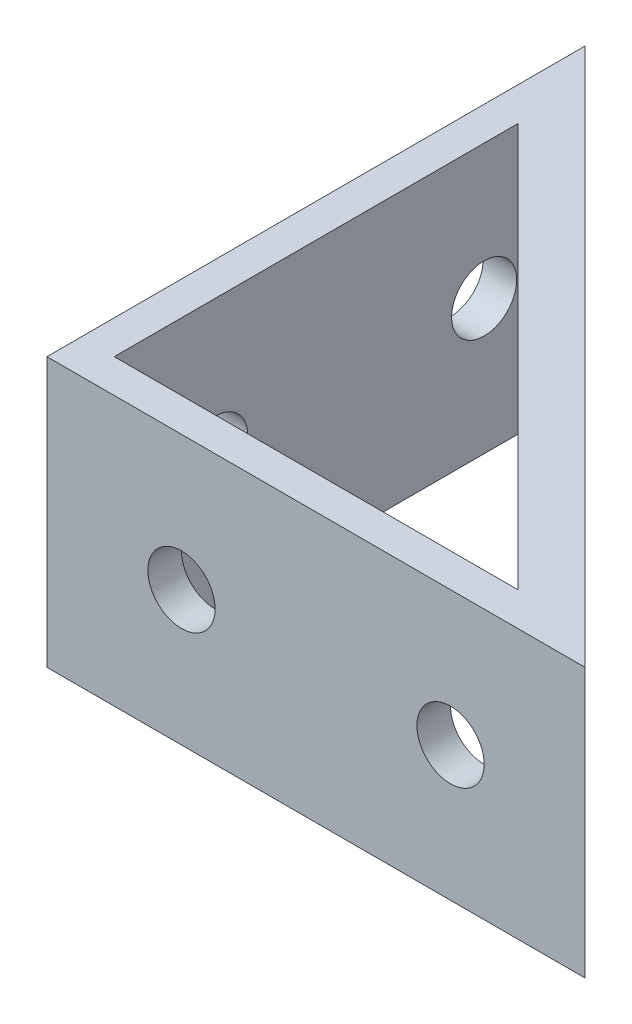
ISO-10303-21;
HEADER;
FILE_DESCRIPTION(('STEP AP214'),'2;1');
FILE_NAME('part.step','',(''),(''),'','','');
FILE_SCHEMA(('AUTOMOTIVE_DESIGN { 1 0 10303 214 1 1 1 1 }'));
ENDSEC;
DATA;
#1=APPLICATION_CONTEXT('core data for automotive mechanical design processes');
#2=APPLICATION_PROTOCOL_DEFINITION('international standard','automotive_design',2000,#1);
#3=PRODUCT_CONTEXT('',#1,'mechanical');
#4=PRODUCT('Part','Part','',(#3));
#5=PRODUCT_RELATED_PRODUCT_CATEGORY('part','',(#4));
#6=PRODUCT_DEFINITION_FORMATION('','',#4);
#7=PRODUCT_DEFINITION_CONTEXT('part definition',#1,'design');
#8=PRODUCT_DEFINITION('design','',#6,#7);
#9=PRODUCT_DEFINITION_SHAPE('','',#8);
#10=(LENGTH_UNIT() NAMED_UNIT(*) SI_UNIT(.MILLI.,.METRE.));
#11=(NAMED_UNIT(*) PLANE_ANGLE_UNIT() SI_UNIT($,.RADIAN.));
#12=(NAMED_UNIT(*) SI_UNIT($,.STERADIAN.) SOLID_ANGLE_UNIT());
#13=UNCERTAINTY_MEASURE_WITH_UNIT(LENGTH_MEASURE(1.E-05),#10,'distance_accuracy_value','');
#14=(GEOMETRIC_REPRESENTATION_CONTEXT(3) GLOBAL_UNCERTAINTY_ASSIGNED_CONTEXT((#13)) GLOBAL_UNIT_ASSIGNED_CONTEXT((#10,
#11,#12)) REPRESENTATION_CONTEXT('',''));
#15=CARTESIAN_POINT('',(0.,0.,0.));
#16=DIRECTION('',(0.,0.,1.));
#17=DIRECTION('',(1.,0.,0.));
#18=AXIS2_PLACEMENT_3D('',#15,#16,#17);
#19=CARTESIAN_POINT('',(0.,25.4,0.));
#20=DIRECTION('',(0.,-1.,0.));
#21=DIRECTION('',(0.,0.,-1.));
#22=AXIS2_PLACEMENT_3D('',#19,#20,#21);
#23=PLANE('',#22);
#24=DIRECTION('',(1.,0.,0.));
#25=VECTOR('',#24,1.);
#26=CARTESIAN_POINT('',(50.8,25.4,0.));
#27=LINE('',#26,#25);
#28=CARTESIAN_POINT('',(0.,25.4,0.));
#29=VERTEX_POINT('',#28);
#30=CARTESIAN_POINT('',(50.8,25.4,0.));
#31=VERTEX_POINT('',#30);
#32=EDGE_CURVE('E136',#29,#31,#27,.T.);
#33=ORIENTED_EDGE('',*,*,#32,.T.);
#34=DIRECTION('',(-0.707106781186547,0.,-0.707106781186547));
#35=VECTOR('',#34,1.);
#36=CARTESIAN_POINT('',(0.,25.4,-50.8));
#37=LINE('',#36,#35);
#38=CARTESIAN_POINT('',(0.,25.4,-50.8));
#39=VERTEX_POINT('',#38);
#40=EDGE_CURVE('E139',#31,#39,#37,.T.);
#41=ORIENTED_EDGE('',*,*,#40,.T.);
#42=DIRECTION('',(0.,0.,1.));
#43=VECTOR('',#42,1.);
#44=CARTESIAN_POINT('',(0.,25.4,0.));
#45=LINE('',#44,#43);
#46=EDGE_CURVE('E142',#39,#29,#45,.T.);
#47=ORIENTED_EDGE('',*,*,#46,.T.);
#48=EDGE_LOOP('',(#33,#41,#47));
#49=FACE_BOUND('',#48,.T.);
#50=DIRECTION('',(1.,0.,0.));
#51=VECTOR('',#50,1.);
#52=CARTESIAN_POINT('',(41.275,25.4,-3.175));
#53=LINE('',#52,#51);
#54=CARTESIAN_POINT('',(3.175,25.4,-3.17499999999999));
#55=VERTEX_POINT('',#54);
#56=CARTESIAN_POINT('',(41.275,25.4,-3.175));
#57=VERTEX_POINT('',#56);
#58=EDGE_CURVE('E100',#55,#57,#53,.T.);
#59=ORIENTED_EDGE('',*,*,#58,.F.);
#60=DIRECTION('',(0.,0.,1.));
#61=VECTOR('',#60,1.);
#62=CARTESIAN_POINT('',(3.175,25.4,-3.17499999999999));
#63=LINE('',#62,#61);
#64=CARTESIAN_POINT('',(3.175,25.4,-41.275));
#65=VERTEX_POINT('',#64);
#66=EDGE_CURVE('E120',#65,#55,#63,.T.);
#67=ORIENTED_EDGE('',*,*,#66,.F.);
#68=DIRECTION('',(-0.707106781186547,0.,-0.707106781186547));
#69=VECTOR('',#68,1.);
#70=CARTESIAN_POINT('',(3.175,25.4,-41.275));
#71=LINE('',#70,#69);
#72=EDGE_CURVE('E110',#57,#65,#71,.T.);
#73=ORIENTED_EDGE('',*,*,#72,.F.);
#74=EDGE_LOOP('',(#59,#67,#73));
#75=FACE_BOUND('',#74,.T.);
#76=ADVANCED_FACE('F36',(#49,#75),#23,.F.);
#77=CARTESIAN_POINT('',(0.,0.,0.));
#78=DIRECTION('',(0.,-1.,0.));
#79=DIRECTION('',(0.,0.,-1.));
#80=AXIS2_PLACEMENT_3D('',#77,#78,#79);
#81=PLANE('',#80);
#82=DIRECTION('',(1.,0.,0.));
#83=VECTOR('',#82,1.);
#84=CARTESIAN_POINT('',(50.8,0.,0.));
#85=LINE('',#84,#83);
#86=CARTESIAN_POINT('',(0.,0.,0.));
#87=VERTEX_POINT('',#86);
#88=CARTESIAN_POINT('',(50.8,0.,0.));
#89=VERTEX_POINT('',#88);
#90=EDGE_CURVE('E117',#87,#89,#85,.T.);
#91=ORIENTED_EDGE('',*,*,#90,.F.);
#92=DIRECTION('',(0.,0.,1.));
#93=VECTOR('',#92,1.);
#94=CARTESIAN_POINT('',(0.,0.,0.));
#95=LINE('',#94,#93);
#96=CARTESIAN_POINT('',(0.,0.,-50.8));
#97=VERTEX_POINT('',#96);
#98=EDGE_CURVE('E140',#97,#87,#95,.T.);
#99=ORIENTED_EDGE('',*,*,#98,.F.);
#100=DIRECTION('',(-0.707106781186547,0.,-0.707106781186547));
#101=VECTOR('',#100,1.);
#102=CARTESIAN_POINT('',(0.,0.,-50.8));
#103=LINE('',#102,#101);
#104=EDGE_CURVE('E147',#89,#97,#103,.T.);
#105=ORIENTED_EDGE('',*,*,#104,.F.);
#106=EDGE_LOOP('',(#91,#99,#105));
#107=FACE_BOUND('',#106,.T.);
#108=DIRECTION('',(0.,0.,1.));
#109=VECTOR('',#108,1.);
#110=CARTESIAN_POINT('',(3.175,0.,-3.17499999999999));
#111=LINE('',#110,#109);
#112=CARTESIAN_POINT('',(3.175,0.,-41.275));
#113=VERTEX_POINT('',#112);
#114=CARTESIAN_POINT('',(3.175,0.,-3.17499999999999));
#115=VERTEX_POINT('',#114);
#116=EDGE_CURVE('E111',#113,#115,#111,.T.);
#117=ORIENTED_EDGE('',*,*,#116,.T.);
#118=DIRECTION('',(1.,0.,0.));
#119=VECTOR('',#118,1.);
#120=CARTESIAN_POINT('',(41.275,0.,-3.175));
#121=LINE('',#120,#119);
#122=CARTESIAN_POINT('',(41.275,0.,-3.175));
#123=VERTEX_POINT('',#122);
#124=EDGE_CURVE('E125',#115,#123,#121,.T.);
#125=ORIENTED_EDGE('',*,*,#124,.T.);
#126=DIRECTION('',(-0.707106781186547,0.,-0.707106781186547));
#127=VECTOR('',#126,1.);
#128=CARTESIAN_POINT('',(3.175,0.,-41.275));
#129=LINE('',#128,#127);
#130=EDGE_CURVE('E128',#123,#113,#129,.T.);
#131=ORIENTED_EDGE('',*,*,#130,.T.);
#132=EDGE_LOOP('',(#117,#125,#131));
#133=FACE_BOUND('',#132,.T.);
#134=ADVANCED_FACE('F195',(#107,#133),#81,.T.);
#135=CARTESIAN_POINT('',(50.8,25.4,0.));
#136=DIRECTION('',(0.,0.,-1.));
#137=DIRECTION('',(-1.,0.,0.));
#138=AXIS2_PLACEMENT_3D('',#135,#136,#137);
#139=PLANE('',#138);
#140=CARTESIAN_POINT('',(38.1,12.7,0.));
#141=DIRECTION('',(0.,0.,1.));
#142=DIRECTION('',(1.,0.,0.));
#143=AXIS2_PLACEMENT_3D('',#140,#141,#142);
#144=CIRCLE('',#143,3.175);
#145=CARTESIAN_POINT('',(41.275,12.7,0.));
#146=VERTEX_POINT('',#145);
#147=EDGE_CURVE('E272',#146,#146,#144,.T.);
#148=ORIENTED_EDGE('',*,*,#147,.F.);
#149=EDGE_LOOP('',(#148));
#150=FACE_BOUND('',#149,.T.);
#151=CARTESIAN_POINT('',(12.7,12.7,0.));
#152=DIRECTION('',(0.,0.,1.));
#153=DIRECTION('',(1.,0.,0.));
#154=AXIS2_PLACEMENT_3D('',#151,#152,#153);
#155=CIRCLE('',#154,3.17499999999999);
#156=CARTESIAN_POINT('',(15.875,12.7,0.));
#157=VERTEX_POINT('',#156);
#158=EDGE_CURVE('E170',#157,#157,#155,.T.);
#159=ORIENTED_EDGE('',*,*,#158,.F.);
#160=EDGE_LOOP('',(#159));
#161=FACE_BOUND('',#160,.T.);
#162=ORIENTED_EDGE('',*,*,#90,.T.);
#163=DIRECTION('',(0.,-1.,0.));
#164=VECTOR('',#163,1.);
#165=CARTESIAN_POINT('',(50.8,25.4,0.));
#166=LINE('',#165,#164);
#167=EDGE_CURVE('E11',#31,#89,#166,.T.);
#168=ORIENTED_EDGE('',*,*,#167,.F.);
#169=ORIENTED_EDGE('',*,*,#32,.F.);
#170=DIRECTION('',(0.,-1.,0.));
#171=VECTOR('',#170,1.);
#172=CARTESIAN_POINT('',(0.,25.4,0.));
#173=LINE('',#172,#171);
#174=EDGE_CURVE('E144',#29,#87,#173,.T.);
#175=ORIENTED_EDGE('',*,*,#174,.T.);
#176=EDGE_LOOP('',(#162,#168,#169,#175));
#177=FACE_BOUND('',#176,.T.);
#178=ADVANCED_FACE('F38',(#150,#161,#177),#139,.F.);
#179=CARTESIAN_POINT('',(0.,25.4,-50.8));
#180=DIRECTION('',(-0.707106781186548,0.,0.707106781186548));
#181=DIRECTION('',(0.707106781186548,0.,0.707106781186548));
#182=AXIS2_PLACEMENT_3D('',#179,#180,#181);
#183=PLANE('',#182);
#184=CARTESIAN_POINT('',(38.1,12.7,-12.7));
#185=DIRECTION('',(-0.707106781186548,0.,0.707106781186548));
#186=DIRECTION('',(0.707106781186548,0.,0.707106781186548));
#187=AXIS2_PLACEMENT_3D('',#184,#185,#186);
#188=ELLIPSE('',#187,4.49012806053457,3.17499999999999);
#189=CARTESIAN_POINT('',(41.275,12.7,-9.52500000000001));
#190=VERTEX_POINT('',#189);
#191=EDGE_CURVE('E219',#190,#190,#188,.T.);
#192=ORIENTED_EDGE('',*,*,#191,.T.);
#193=EDGE_LOOP('',(#192));
#194=FACE_BOUND('',#193,.T.);
#195=CARTESIAN_POINT('',(12.7,12.7,-38.1));
#196=DIRECTION('',(-0.707106781186548,0.,0.707106781186548));
#197=DIRECTION('',(0.707106781186548,0.,0.707106781186548));
#198=AXIS2_PLACEMENT_3D('',#195,#196,#197);
#199=ELLIPSE('',#198,4.49012806053456,3.17499999999999);
#200=CARTESIAN_POINT('',(15.875,12.7,-34.925));
#201=VERTEX_POINT('',#200);
#202=EDGE_CURVE('E169',#201,#201,#199,.T.);
#203=ORIENTED_EDGE('',*,*,#202,.T.);
#204=EDGE_LOOP('',(#203));
#205=FACE_BOUND('',#204,.T.);
#206=ORIENTED_EDGE('',*,*,#104,.T.);
#207=DIRECTION('',(0.,-1.,0.));
#208=VECTOR('',#207,1.);
#209=CARTESIAN_POINT('',(0.,25.4,-50.8));
#210=LINE('',#209,#208);
#211=EDGE_CURVE('E50',#39,#97,#210,.T.);
#212=ORIENTED_EDGE('',*,*,#211,.F.);
#213=ORIENTED_EDGE('',*,*,#40,.F.);
#214=ORIENTED_EDGE('',*,*,#167,.T.);
#215=EDGE_LOOP('',(#206,#212,#213,#214));
#216=FACE_BOUND('',#215,.T.);
#217=ADVANCED_FACE('F208',(#194,#205,#216),#183,.F.);
#218=CARTESIAN_POINT('',(0.,25.4,0.));
#219=DIRECTION('',(1.,0.,0.));
#220=DIRECTION('',(0.,0.,-1.));
#221=AXIS2_PLACEMENT_3D('',#218,#219,#220);
#222=PLANE('',#221);
#223=CARTESIAN_POINT('',(0.,12.7,-12.7));
#224=DIRECTION('',(-1.,0.,0.));
#225=DIRECTION('',(0.,0.,1.));
#226=AXIS2_PLACEMENT_3D('',#223,#224,#225);
#227=CIRCLE('',#226,3.0734);
#228=CARTESIAN_POINT('',(0.,12.7,-9.6266));
#229=VERTEX_POINT('',#228);
#230=EDGE_CURVE('E161',#229,#229,#227,.T.);
#231=ORIENTED_EDGE('',*,*,#230,.F.);
#232=EDGE_LOOP('',(#231));
#233=FACE_BOUND('',#232,.T.);
#234=CARTESIAN_POINT('',(0.,12.7,-38.1));
#235=DIRECTION('',(-1.,0.,0.));
#236=DIRECTION('',(0.,0.,1.));
#237=AXIS2_PLACEMENT_3D('',#234,#235,#236);
#238=CIRCLE('',#237,3.0734);
#239=CARTESIAN_POINT('',(0.,12.7,-35.0266));
#240=VERTEX_POINT('',#239);
#241=EDGE_CURVE('E157',#240,#240,#238,.T.);
#242=ORIENTED_EDGE('',*,*,#241,.F.);
#243=EDGE_LOOP('',(#242));
#244=FACE_BOUND('',#243,.T.);
#245=ORIENTED_EDGE('',*,*,#98,.T.);
#246=ORIENTED_EDGE('',*,*,#174,.F.);
#247=ORIENTED_EDGE('',*,*,#46,.F.);
#248=ORIENTED_EDGE('',*,*,#211,.T.);
#249=EDGE_LOOP('',(#245,#246,#247,#248));
#250=FACE_BOUND('',#249,.T.);
#251=ADVANCED_FACE('F206',(#233,#244,#250),#222,.F.);
#252=CARTESIAN_POINT('',(41.275,25.4,-3.175));
#253=DIRECTION('',(0.,0.,-1.));
#254=DIRECTION('',(-1.,0.,0.));
#255=AXIS2_PLACEMENT_3D('',#252,#253,#254);
#256=PLANE('',#255);
#257=CARTESIAN_POINT('',(12.7,12.7,-3.17499999999999));
#258=DIRECTION('',(0.,0.,-1.));
#259=DIRECTION('',(-1.,0.,0.));
#260=AXIS2_PLACEMENT_3D('',#257,#258,#259);
#261=CIRCLE('',#260,3.17499999999999);
#262=CARTESIAN_POINT('',(9.52500000000001,12.7,-3.17499999999999));
#263=VERTEX_POINT('',#262);
#264=EDGE_CURVE('E260',#263,#263,#261,.T.);
#265=ORIENTED_EDGE('',*,*,#264,.F.);
#266=EDGE_LOOP('',(#265));
#267=FACE_BOUND('',#266,.T.);
#268=DIRECTION('',(0.,-1.,0.));
#269=VECTOR('',#268,1.);
#270=CARTESIAN_POINT('',(41.275,25.4,-3.175));
#271=LINE('',#270,#269);
#272=CARTESIAN_POINT('',(41.275,12.7,-3.17500000000001));
#273=VERTEX_POINT('',#272);
#274=EDGE_CURVE('E103',#57,#273,#271,.T.);
#275=ORIENTED_EDGE('',*,*,#274,.T.);
#276=CARTESIAN_POINT('',(38.1,12.7,-3.175));
#277=DIRECTION('',(0.,0.,-1.));
#278=DIRECTION('',(-1.,0.,0.));
#279=AXIS2_PLACEMENT_3D('',#276,#277,#278);
#280=CIRCLE('',#279,3.17499999999999);
#281=EDGE_CURVE('E56',#273,#273,#280,.T.);
#282=ORIENTED_EDGE('',*,*,#281,.F.);
#283=EDGE_CURVE('E118',#273,#123,#271,.T.);
#284=ORIENTED_EDGE('',*,*,#283,.T.);
#285=ORIENTED_EDGE('',*,*,#124,.F.);
#286=DIRECTION('',(0.,-1.,0.));
#287=VECTOR('',#286,1.);
#288=CARTESIAN_POINT('',(3.175,25.4,-3.17499999999999));
#289=LINE('',#288,#287);
#290=EDGE_CURVE('E106',#55,#115,#289,.T.);
#291=ORIENTED_EDGE('',*,*,#290,.F.);
#292=ORIENTED_EDGE('',*,*,#58,.T.);
#293=EDGE_LOOP('',(#275,#282,#284,#285,#291,#292));
#294=FACE_BOUND('',#293,.T.);
#295=ADVANCED_FACE('F102',(#267,#294),#256,.T.);
#296=CARTESIAN_POINT('',(3.175,25.4,-41.275));
#297=DIRECTION('',(-0.707106781186548,0.,0.707106781186548));
#298=DIRECTION('',(0.707106781186548,0.,0.707106781186548));
#299=AXIS2_PLACEMENT_3D('',#296,#297,#298);
#300=PLANE('',#299);
#301=CARTESIAN_POINT('',(12.7,12.7,-31.75));
#302=DIRECTION('',(-0.707106781186548,0.,0.707106781186548));
#303=DIRECTION('',(0.707106781186548,0.,0.707106781186548));
#304=AXIS2_PLACEMENT_3D('',#301,#302,#303);
#305=ELLIPSE('',#304,4.49012806053456,3.17499999999999);
#306=CARTESIAN_POINT('',(15.875,12.7,-28.575));
#307=VERTEX_POINT('',#306);
#308=EDGE_CURVE('E263',#307,#307,#305,.T.);
#309=ORIENTED_EDGE('',*,*,#308,.F.);
#310=EDGE_LOOP('',(#309));
#311=FACE_BOUND('',#310,.T.);
#312=CARTESIAN_POINT('',(31.75,12.7,-12.7));
#313=DIRECTION('',(-0.707106781186548,0.,0.707106781186548));
#314=DIRECTION('',(-0.707106781186548,0.,-0.707106781186548));
#315=AXIS2_PLACEMENT_3D('',#312,#313,#314);
#316=ELLIPSE('',#315,4.34644396259746,3.0734);
#317=CARTESIAN_POINT('',(28.6766,12.7,-15.7734));
#318=VERTEX_POINT('',#317);
#319=EDGE_CURVE('E160',#318,#318,#316,.T.);
#320=ORIENTED_EDGE('',*,*,#319,.F.);
#321=EDGE_LOOP('',(#320));
#322=FACE_BOUND('',#321,.T.);
#323=CARTESIAN_POINT('',(6.35,12.7,-38.1));
#324=DIRECTION('',(-0.707106781186548,0.,0.707106781186548));
#325=DIRECTION('',(-0.707106781186548,0.,-0.707106781186548));
#326=AXIS2_PLACEMENT_3D('',#323,#324,#325);
#327=ELLIPSE('',#326,4.34644396259746,3.0734);
#328=CARTESIAN_POINT('',(3.27660000000001,12.7,-41.1734));
#329=VERTEX_POINT('',#328);
#330=EDGE_CURVE('E129',#329,#329,#327,.T.);
#331=ORIENTED_EDGE('',*,*,#330,.F.);
#332=EDGE_LOOP('',(#331));
#333=FACE_BOUND('',#332,.T.);
#334=ORIENTED_EDGE('',*,*,#283,.F.);
#335=CARTESIAN_POINT('',(38.1,12.7,-6.35));
#336=DIRECTION('',(-0.707106781186548,0.,0.707106781186548));
#337=DIRECTION('',(0.707106781186548,0.,0.707106781186548));
#338=AXIS2_PLACEMENT_3D('',#335,#336,#337);
#339=ELLIPSE('',#338,4.49012806053457,3.17499999999999);
#340=EDGE_CURVE('E116',#273,#273,#339,.T.);
#341=ORIENTED_EDGE('',*,*,#340,.F.);
#342=ORIENTED_EDGE('',*,*,#274,.F.);
#343=ORIENTED_EDGE('',*,*,#72,.T.);
#344=DIRECTION('',(0.,-1.,0.));
#345=VECTOR('',#344,1.);
#346=CARTESIAN_POINT('',(3.175,25.4,-41.275));
#347=LINE('',#346,#345);
#348=EDGE_CURVE('E64',#65,#113,#347,.T.);
#349=ORIENTED_EDGE('',*,*,#348,.T.);
#350=ORIENTED_EDGE('',*,*,#130,.F.);
#351=EDGE_LOOP('',(#334,#341,#342,#343,#349,#350));
#352=FACE_BOUND('',#351,.T.);
#353=ADVANCED_FACE('F115',(#311,#322,#333,#352),#300,.T.);
#354=CARTESIAN_POINT('',(3.175,25.4,-3.17499999999999));
#355=DIRECTION('',(1.,0.,0.));
#356=DIRECTION('',(0.,0.,-1.));
#357=AXIS2_PLACEMENT_3D('',#354,#355,#356);
#358=PLANE('',#357);
#359=CARTESIAN_POINT('',(3.175,12.7,-12.7));
#360=DIRECTION('',(1.,0.,0.));
#361=DIRECTION('',(0.,0.,-1.));
#362=AXIS2_PLACEMENT_3D('',#359,#360,#361);
#363=CIRCLE('',#362,3.0734);
#364=CARTESIAN_POINT('',(3.175,12.7,-15.7734));
#365=VERTEX_POINT('',#364);
#366=EDGE_CURVE('E158',#365,#365,#363,.T.);
#367=ORIENTED_EDGE('',*,*,#366,.F.);
#368=EDGE_LOOP('',(#367));
#369=FACE_BOUND('',#368,.T.);
#370=CARTESIAN_POINT('',(3.175,12.7,-38.1));
#371=DIRECTION('',(1.,0.,0.));
#372=DIRECTION('',(0.,0.,-1.));
#373=AXIS2_PLACEMENT_3D('',#370,#371,#372);
#374=CIRCLE('',#373,3.0734);
#375=CARTESIAN_POINT('',(3.175,12.7,-41.1734));
#376=VERTEX_POINT('',#375);
#377=EDGE_CURVE('E154',#376,#376,#374,.T.);
#378=ORIENTED_EDGE('',*,*,#377,.F.);
#379=EDGE_LOOP('',(#378));
#380=FACE_BOUND('',#379,.T.);
#381=ORIENTED_EDGE('',*,*,#116,.F.);
#382=ORIENTED_EDGE('',*,*,#348,.F.);
#383=ORIENTED_EDGE('',*,*,#66,.T.);
#384=ORIENTED_EDGE('',*,*,#290,.T.);
#385=EDGE_LOOP('',(#381,#382,#383,#384));
#386=FACE_BOUND('',#385,.T.);
#387=ADVANCED_FACE('F234',(#369,#380,#386),#358,.T.);
#388=CARTESIAN_POINT('',(0.,12.7,-38.1));
#389=DIRECTION('',(-1.,0.,0.));
#390=DIRECTION('',(0.,0.,1.));
#391=AXIS2_PLACEMENT_3D('',#388,#389,#390);
#392=CYLINDRICAL_SURFACE('',#391,3.0734);
#393=ORIENTED_EDGE('',*,*,#377,.T.);
#394=EDGE_LOOP('',(#393));
#395=FACE_BOUND('',#394,.T.);
#396=ORIENTED_EDGE('',*,*,#241,.T.);
#397=EDGE_LOOP('',(#396));
#398=FACE_BOUND('',#397,.T.);
#399=ADVANCED_FACE('F171',(#395,#398),#392,.F.);
#400=CARTESIAN_POINT('',(9.52500000000001,12.7,-35.0266));
#401=CARTESIAN_POINT('',(9.52500039683266,12.6306788082452,-35.026600396555));
#402=CARTESIAN_POINT('',(9.52727565076083,12.561335905266,-35.0289507034608));
#403=CARTESIAN_POINT('',(9.53632846097364,12.4232279941052,-35.0383041450781));
#404=CARTESIAN_POINT('',(9.54310909294951,12.3544634132246,-35.045310458311));
#405=CARTESIAN_POINT('',(9.56104804656948,12.2179722693034,-35.0638531819387));
#406=CARTESIAN_POINT('',(9.57221568103732,12.1502482350681,-35.0753992294268));
#407=CARTESIAN_POINT('',(9.59869418570043,12.0164893753259,-35.1027892384785));
#408=CARTESIAN_POINT('',(9.61400704281748,11.9504553765576,-35.1186352611501));
#409=CARTESIAN_POINT('',(9.66547801684176,11.756582378956,-35.1719336377483));
#410=CARTESIAN_POINT('',(9.70732931345552,11.6318048160511,-35.2153120795879));
#411=CARTESIAN_POINT('',(9.8035668574351,11.3931254835378,-35.3152792968522));
#412=CARTESIAN_POINT('',(9.85795139698809,11.2792222351546,-35.3718662724606));
#413=CARTESIAN_POINT('',(10.0010036019658,11.0188671706739,-35.5211679375295));
#414=CARTESIAN_POINT('',(10.0945943701666,10.8781639402059,-35.6191917455489));
#415=CARTESIAN_POINT('',(10.295500147409,10.6201252001946,-35.8310921232077));
#416=CARTESIAN_POINT('',(10.402854920368,10.5028600187033,-35.9450147119878));
#417=CARTESIAN_POINT('',(10.589864152517,10.3253934030659,-36.1458509346056));
#418=CARTESIAN_POINT('',(10.6672288681681,10.2590110720532,-36.2295619560347));
#419=CARTESIAN_POINT('',(10.8245395686341,10.1361686467461,-36.4018354864288));
#420=CARTESIAN_POINT('',(10.9044871570597,10.0797148625119,-36.4904010341168));
#421=CARTESIAN_POINT('',(11.0652557178703,9.97651904323471,-36.6719495152754));
#422=CARTESIAN_POINT('',(11.1460751868958,9.92976245282066,-36.7649255670536));
#423=CARTESIAN_POINT('',(11.3066807153379,9.84562624311215,-36.9557806089748));
#424=CARTESIAN_POINT('',(11.3864676493978,9.80823811725618,-37.0536550537704));
#425=CARTESIAN_POINT('',(11.5151313038717,9.75384482747217,-37.2219815348654));
#426=CARTESIAN_POINT('',(11.5653610498185,9.73421724198008,-37.2905553846447));
#427=CARTESIAN_POINT('',(11.6614737465532,9.69922151944206,-37.4318461524043));
#428=CARTESIAN_POINT('',(11.7073577782026,9.68385232141363,-37.5045620329396));
#429=CARTESIAN_POINT('',(11.7771746957723,9.66192144938713,-37.6323899815357));
#430=CARTESIAN_POINT('',(11.8034977208683,9.6541070136279,-37.6859490635329));
#431=CARTESIAN_POINT('',(11.8488204366041,9.64113187963571,-37.796386538443));
#432=CARTESIAN_POINT('',(11.8678432360189,9.6359627899677,-37.853253789952));
#433=CARTESIAN_POINT('',(11.891460775703,9.62965676188194,-37.9559458057535));
#434=CARTESIAN_POINT('',(11.8984167933014,9.62785152798549,-38.00116270271));
#435=CARTESIAN_POINT('',(11.9044804942254,9.62627482238866,-38.0921258045021));
#436=CARTESIAN_POINT('',(11.9035996646989,9.62650037399529,-38.1378711364953));
#437=CARTESIAN_POINT('',(11.8942264745706,9.62894602487113,-38.2282952295217));
#438=CARTESIAN_POINT('',(11.8857627842926,9.63115861136022,-38.2729773577844));
#439=CARTESIAN_POINT('',(11.8627582642203,9.63735565850846,-38.3606503838685));
#440=CARTESIAN_POINT('',(11.8482031952965,9.6413442721928,-38.403637059095));
#441=CARTESIAN_POINT('',(11.8098303317071,9.65225941997566,-38.5000913893796));
#442=CARTESIAN_POINT('',(11.7845462371258,9.65970592566741,-38.5528999185465));
#443=CARTESIAN_POINT('',(11.7295029195067,9.67682234079862,-38.6557926854706));
#444=CARTESIAN_POINT('',(11.6997343932115,9.68649689507204,-38.7058709578719));
#445=CARTESIAN_POINT('',(11.6060504600162,9.71868710893228,-38.8535255786778));
#446=CARTESIAN_POINT('',(11.5380911971857,9.74428323675103,-38.9478299545681));
#447=CARTESIAN_POINT('',(11.3920026364501,9.80574880729654,-39.1392560456502));
#448=CARTESIAN_POINT('',(11.3135111783581,9.84234253329899,-39.2358496861541));
#449=CARTESIAN_POINT('',(11.1553589587351,9.92463183693571,-39.424266667652));
#450=CARTESIAN_POINT('',(11.0756971217155,9.97033634331229,-39.5160852167754));
#451=CARTESIAN_POINT('',(10.9175445154591,10.0708860462397,-39.6950031133203));
#452=CARTESIAN_POINT('',(10.8390507094622,10.1256999944262,-39.7821172892005));
#453=CARTESIAN_POINT('',(10.684452614869,10.2448593282655,-39.9517017116194));
#454=CARTESIAN_POINT('',(10.6083468489669,10.3091986745146,-40.0341748553231));
#455=CARTESIAN_POINT('',(10.4246022882548,10.4806295673448,-40.2317793711007));
#456=CARTESIAN_POINT('',(10.3190645523176,10.5935531975996,-40.3439186545355));
#457=CARTESIAN_POINT('',(10.1205793292373,10.8419332977705,-40.5535043749082));
#458=CARTESIAN_POINT('',(10.0276157568123,10.9773604763,-40.6509696017927));
#459=CARTESIAN_POINT('',(9.8784831716564,11.2381559409436,-40.8067516534406));
#460=CARTESIAN_POINT('',(9.81872323247184,11.3591300939485,-40.8689597586148));
#461=CARTESIAN_POINT('',(9.71346577793322,11.6136710463775,-40.978327735609));
#462=CARTESIAN_POINT('',(9.66795970882889,11.7472302306766,-41.0254966327662));
#463=CARTESIAN_POINT('',(9.61270080871968,11.9553777876038,-41.0827173130146));
#464=CARTESIAN_POINT('',(9.59639849074456,12.0264452368614,-41.0995863206279));
#465=CARTESIAN_POINT('',(9.56860844674832,12.1704913721621,-41.1283311248253));
#466=CARTESIAN_POINT('',(9.55711819588431,12.2434690345244,-41.1402095399333));
#467=CARTESIAN_POINT('',(9.5392347718739,12.390675816468,-41.1586933241296));
#468=CARTESIAN_POINT('',(9.53283913894371,12.464904314421,-41.1653012379238));
#469=CARTESIAN_POINT('',(9.52529022483485,12.613884181382,-41.1731002972184));
#470=CARTESIAN_POINT('',(9.52413619192538,12.6886354738726,-41.1742922194604));
#471=CARTESIAN_POINT('',(9.52819582291668,12.8914017442842,-41.1700987656275));
#472=CARTESIAN_POINT('',(9.53855374847779,13.0192762419251,-41.1593998471784));
#473=CARTESIAN_POINT('',(9.57410366175011,13.270568221757,-41.1226497317589));
#474=CARTESIAN_POINT('',(9.59929717403773,13.3939852444928,-41.0965969569521));
#475=CARTESIAN_POINT('',(9.66278204811765,13.6334140703788,-41.0308579534565));
#476=CARTESIAN_POINT('',(9.70106270439631,13.7494318345,-40.9911828679431));
#477=CARTESIAN_POINT('',(9.78861783189572,13.9723398718671,-40.9002603941702));
#478=CARTESIAN_POINT('',(9.83789599613748,14.0792270623069,-40.849009118495));
#479=CARTESIAN_POINT('',(9.97173505892948,14.3329907929611,-40.7094364966777));
#480=CARTESIAN_POINT('',(10.0617488394045,14.4737787480191,-40.6152602627356));
#481=CARTESIAN_POINT('',(10.2556711344051,14.7327788650604,-40.4110499306676));
#482=CARTESIAN_POINT('',(10.3596205852234,14.8509219234585,-40.3009690352912));
#483=CARTESIAN_POINT('',(10.5415785983811,15.0307832291189,-40.1061728187211));
#484=CARTESIAN_POINT('',(10.6172309653375,15.098453482415,-40.0246270780734));
#485=CARTESIAN_POINT('',(10.7713438757539,15.2240426519338,-39.8567017663707));
#486=CARTESIAN_POINT('',(10.849806013039,15.2819559238233,-39.7703194356194));
#487=CARTESIAN_POINT('',(11.0079564021312,15.3882483329156,-39.593238268062));
#488=CARTESIAN_POINT('',(11.0876427559726,15.4366408832264,-39.5025457306953));
#489=CARTESIAN_POINT('',(11.2465726006663,15.5242461482576,-39.3165544263157));
#490=CARTESIAN_POINT('',(11.3258163776141,15.5634656860711,-39.2212591469939));
#491=CARTESIAN_POINT('',(11.4585010162335,15.6228364258141,-39.0530519980715));
#492=CARTESIAN_POINT('',(11.5127985812422,15.6452259739925,-38.9816007292257));
#493=CARTESIAN_POINT('',(11.6175676309172,15.6853104652194,-38.8345328638618));
#494=CARTESIAN_POINT('',(11.6680383960039,15.7030045268992,-38.7589154885548));
#495=CARTESIAN_POINT('',(11.7471836134104,15.7288564732669,-38.6244466026849));
#496=CARTESIAN_POINT('',(11.777935146485,15.7382918505973,-38.5670897250767));
#497=CARTESIAN_POINT('',(11.8319292072266,15.7541554726666,-38.4485302727298));
#498=CARTESIAN_POINT('',(11.8551955210208,15.7605932727101,-38.3873406331637));
#499=CARTESIAN_POINT('',(11.8843065833825,15.7684577852647,-38.2798180506667));
#500=CARTESIAN_POINT('',(11.8932666202006,15.7708027414836,-38.2344313130126));
#501=CARTESIAN_POINT('',(11.9033761853941,15.7734421827274,-38.1427821033256));
#502=CARTESIAN_POINT('',(11.904543247141,15.7737412707768,-38.0965218321725));
#503=CARTESIAN_POINT('',(11.8988593103698,15.7722636603883,-38.0046165559106));
#504=CARTESIAN_POINT('',(11.8920173642076,15.7704893055085,-37.958970915039));
#505=CARTESIAN_POINT('',(11.8716580848829,15.7650580978308,-37.8692652392938));
#506=CARTESIAN_POINT('',(11.8581225878701,15.7613961215668,-37.8252098708392));
#507=CARTESIAN_POINT('',(11.823577261548,15.7517005317263,-37.7319424321048));
#508=CARTESIAN_POINT('',(11.8016978648147,15.7453734323248,-37.6830941297728));
#509=CARTESIAN_POINT('',(11.7536897844971,15.730801787719,-37.5877961180619));
#510=CARTESIAN_POINT('',(11.7275530877594,15.7225536138038,-37.5413511538243));
#511=CARTESIAN_POINT('',(11.6448747969728,15.695109040289,-37.404405290859));
#512=CARTESIAN_POINT('',(11.5843306691541,15.6732802215984,-37.3168849658778));
#513=CARTESIAN_POINT('',(11.4540454213656,15.6212317586537,-37.1401509036076));
#514=CARTESIAN_POINT('',(11.3839562777972,15.590478169583,-37.0513678465805));
#515=CARTESIAN_POINT('',(11.242050000511,15.5215668974306,-36.8780173965303));
#516=CARTESIAN_POINT('',(11.1702313577447,15.4834025267965,-36.7934538985666));
#517=CARTESIAN_POINT('',(11.0269030022711,15.3996761421081,-36.6282375082537));
#518=CARTESIAN_POINT('',(10.9553929721568,15.3541336570358,-36.5475750030213));
#519=CARTESIAN_POINT('',(10.8137278701138,15.2553976599718,-36.3899207887162));
#520=CARTESIAN_POINT('',(10.7435722044274,15.2022075912692,-36.3129274482807));
#521=CARTESIAN_POINT('',(10.5542933960039,15.0454132695956,-36.1070377881527));
#522=CARTESIAN_POINT('',(10.4374732541334,14.9336922730038,-35.9820324322849));
#523=CARTESIAN_POINT('',(10.2162613934589,14.6847749025218,-35.7472086672859));
#524=CARTESIAN_POINT('',(10.1118542555638,14.5476106876861,-35.6373713887865));
#525=CARTESIAN_POINT('',(9.9455906213187,14.2848169138463,-35.4632558040257));
#526=CARTESIAN_POINT('',(9.8796129334614,14.1648229764762,-35.3944438876977));
#527=CARTESIAN_POINT('',(9.7616876640527,13.910972478166,-35.2717266026907));
#528=CARTESIAN_POINT('',(9.70972837895511,13.7771276109429,-35.2178087984583));
#529=CARTESIAN_POINT('',(9.62990338397436,13.5188957052509,-35.1350793602351));
#530=CARTESIAN_POINT('',(9.59959836001538,13.396081294629,-35.1037208710657));
#531=CARTESIAN_POINT('',(9.55377027211064,13.1450133765444,-35.0563243543788));
#532=CARTESIAN_POINT('',(9.53820726186016,13.0167755568403,-35.0402449249536));
#533=CARTESIAN_POINT('',(9.52870549720238,12.8565433346454,-35.0304281567299));
#534=CARTESIAN_POINT('',(9.52731743557044,12.8252739300552,-35.0289941056034));
#535=CARTESIAN_POINT('',(9.52546454078746,12.7626711675471,-35.0270798792444));
#536=CARTESIAN_POINT('',(9.52499982060518,12.7313378022731,-35.0265998207307));
#537=CARTESIAN_POINT('',(9.52500000000001,12.7,-35.0266));
#538=B_SPLINE_CURVE_WITH_KNOTS('',3,(#400,#401,#402,#403,#404,#405,#406,#407,#408,#409,#410,
#411,#412,#413,#414,#415,#416,#417,#418,#419,#420,#421,#422,#423,#424,#425,#426,#427,#428,#429,
#430,#431,#432,#433,#434,#435,#436,#437,#438,#439,#440,#441,#442,#443,#444,#445,#446,#447,#448,
#449,#450,#451,#452,#453,#454,#455,#456,#457,#458,#459,#460,#461,#462,#463,#464,#465,#466,#467,
#468,#469,#470,#471,#472,#473,#474,#475,#476,#477,#478,#479,#480,#481,#482,#483,#484,#485,#486,
#487,#488,#489,#490,#491,#492,#493,#494,#495,#496,#497,#498,#499,#500,#501,#502,#503,#504,#505,
#506,#507,#508,#509,#510,#511,#512,#513,#514,#515,#516,#517,#518,#519,#520,#521,#522,#523,#524,
#525,#526,#527,#528,#529,#530,#531,#532,#533,#534,#535,#536,#537),.UNSPECIFIED.,.T.,.F.,(4,2,2,
2,2,2,2,2,2,2,2,2,2,2,2,2,2,2,2,2,2,2,2,2,2,2,2,2,2,2,2,2,2,2,2,2,2,2,2,2,2,2,2,2,2,2,2,2,2,2,2,
2,2,2,2,2,2,2,2,2,2,2,2,2,2,2,2,2,4),(0.,0.207924504009103,0.415991098097682,0.624501788241386,
0.833112600937215,1.24681183714606,1.66045473489975,2.24332601450119,2.82792083035165,
3.22317717676182,3.61868382652133,4.01359245912408,4.40814120479324,4.6696857279199,
4.93116502818709,5.11137522362124,5.29101016561287,5.42772674566108,5.56424296138912,
5.70024518597894,5.8365671192478,6.01319636099106,6.19019721106065,6.54649583108592,
6.93530485885655,7.32449681712852,7.71238028057278,8.10001885857474,8.67090614871901,
9.24105609113826,9.685171422425,10.1290197271383,10.3532471537495,10.5773567826539,
10.8013581412351,11.0253273733579,11.4094733761568,11.7936588625414,12.177530827452,
12.5615318930714,13.133810543997,13.7078086970024,14.0979457733137,14.4883077714709,
14.8781158133382,15.2676329785028,15.5449350449729,15.8222891258145,16.0192380442099,
16.2155547811728,16.3539220395506,16.4919778810019,16.6298778323741,16.768154064396,
16.9294684677761,17.0910900845904,17.4162690499393,17.7676208918923,18.1192912827134,
18.4700456121389,18.8206425077465,19.4314565713657,20.0415037907823,20.4996123750428,
20.9573373062213,21.3467056942418,21.7350159703353,21.8290002162876,21.9229959602936),.UNSPECIFIED.);
#539=CARTESIAN_POINT('',(9.52500000000001,12.7,-35.0266));
#540=VERTEX_POINT('',#539);
#541=EDGE_CURVE('E162',#540,#540,#538,.T.);
#542=ORIENTED_EDGE('',*,*,#541,.T.);
#543=EDGE_LOOP('',(#542));
#544=FACE_BOUND('',#543,.T.);
#545=ORIENTED_EDGE('',*,*,#330,.T.);
#546=EDGE_LOOP('',(#545));
#547=FACE_BOUND('',#546,.T.);
#548=ADVANCED_FACE('F185',(#544,#547),#392,.F.);
#549=CARTESIAN_POINT('',(0.,12.7,-12.7));
#550=DIRECTION('',(-1.,0.,0.));
#551=DIRECTION('',(0.,0.,1.));
#552=AXIS2_PLACEMENT_3D('',#549,#550,#551);
#553=CYLINDRICAL_SURFACE('',#552,3.0734);
#554=ORIENTED_EDGE('',*,*,#366,.T.);
#555=EDGE_LOOP('',(#554));
#556=FACE_BOUND('',#555,.T.);
#557=ORIENTED_EDGE('',*,*,#230,.T.);
#558=EDGE_LOOP('',(#557));
#559=FACE_BOUND('',#558,.T.);
#560=ADVANCED_FACE('F181',(#556,#559),#553,.F.);
#561=CARTESIAN_POINT('',(34.925,12.7,-9.6266));
#562=CARTESIAN_POINT('',(34.9250003968326,12.6306788082452,-9.62660039655501));
#563=CARTESIAN_POINT('',(34.9272756507608,12.561335905266,-9.62895070346077));
#564=CARTESIAN_POINT('',(34.9363284609736,12.4232279941052,-9.63830414507814));
#565=CARTESIAN_POINT('',(34.9431090929495,12.3544634132246,-9.64531045831102));
#566=CARTESIAN_POINT('',(34.9610480465695,12.2179722693034,-9.66385318193875));
#567=CARTESIAN_POINT('',(34.9722156810373,12.1502482350681,-9.67539922942683));
#568=CARTESIAN_POINT('',(34.9986941857004,12.0164893753259,-9.70278923847855));
#569=CARTESIAN_POINT('',(35.0140070428175,11.9504553765576,-9.71863526115009));
#570=CARTESIAN_POINT('',(35.0654780168418,11.756582378956,-9.77193363774834));
#571=CARTESIAN_POINT('',(35.1073293134555,11.6318048160511,-9.81531207958794));
#572=CARTESIAN_POINT('',(35.2035668574351,11.3931254835378,-9.91527929685217));
#573=CARTESIAN_POINT('',(35.2579513969881,11.2792222351546,-9.97186627246058));
#574=CARTESIAN_POINT('',(35.4010036019658,11.0188671706739,-10.1211679375296));
#575=CARTESIAN_POINT('',(35.4945943701666,10.8781639402059,-10.2191917455489));
#576=CARTESIAN_POINT('',(35.695500147409,10.6201252001946,-10.4310921232077));
#577=CARTESIAN_POINT('',(35.8028549203679,10.5028600187033,-10.5450147119878));
#578=CARTESIAN_POINT('',(35.989864152517,10.3253934030659,-10.7458509346056));
#579=CARTESIAN_POINT('',(36.0672288681681,10.2590110720532,-10.8295619560347));
#580=CARTESIAN_POINT('',(36.2245395686341,10.1361686467461,-11.0018354864288));
#581=CARTESIAN_POINT('',(36.3044871570597,10.0797148625119,-11.0904010341168));
#582=CARTESIAN_POINT('',(36.4652557178703,9.97651904323471,-11.2719495152754));
#583=CARTESIAN_POINT('',(36.5460751868958,9.92976245282066,-11.3649255670536));
#584=CARTESIAN_POINT('',(36.7066807153379,9.84562624311214,-11.5557806089748));
#585=CARTESIAN_POINT('',(36.7864676493978,9.80823811725618,-11.6536550537704));
#586=CARTESIAN_POINT('',(36.9151313038717,9.75384482747217,-11.8219815348655));
#587=CARTESIAN_POINT('',(36.9653610498185,9.73421724198007,-11.8905553846447));
#588=CARTESIAN_POINT('',(37.0614737465532,9.69922151944206,-12.0318461524043));
#589=CARTESIAN_POINT('',(37.1073577782026,9.68385232141363,-12.1045620329396));
#590=CARTESIAN_POINT('',(37.1771746957723,9.66192144938713,-12.2323899815357));
#591=CARTESIAN_POINT('',(37.2034977208683,9.6541070136279,-12.2859490635329));
#592=CARTESIAN_POINT('',(37.2488204366041,9.64113187963571,-12.396386538443));
#593=CARTESIAN_POINT('',(37.2678432360189,9.6359627899677,-12.453253789952));
#594=CARTESIAN_POINT('',(37.291460775703,9.62965676188194,-12.5559458057535));
#595=CARTESIAN_POINT('',(37.2984167933014,9.62785152798549,-12.60116270271));
#596=CARTESIAN_POINT('',(37.3044804942254,9.62627482238866,-12.6921258045021));
#597=CARTESIAN_POINT('',(37.3035996646989,9.62650037399529,-12.7378711364953));
#598=CARTESIAN_POINT('',(37.2942264745706,9.62894602487113,-12.8282952295217));
#599=CARTESIAN_POINT('',(37.2857627842926,9.63115861136022,-12.8729773577844));
#600=CARTESIAN_POINT('',(37.2627582642203,9.63735565850846,-12.9606503838685));
#601=CARTESIAN_POINT('',(37.2482031952965,9.6413442721928,-13.0036370590951));
#602=CARTESIAN_POINT('',(37.2098303317071,9.65225941997566,-13.1000913893797));
#603=CARTESIAN_POINT('',(37.1845462371257,9.65970592566741,-13.1528999185465));
#604=CARTESIAN_POINT('',(37.1295029195067,9.67682234079863,-13.2557926854706));
#605=CARTESIAN_POINT('',(37.0997343932115,9.68649689507204,-13.3058709578719));
#606=CARTESIAN_POINT('',(37.0060504600162,9.71868710893229,-13.4535255786778));
#607=CARTESIAN_POINT('',(36.9380911971856,9.74428323675104,-13.5478299545682));
#608=CARTESIAN_POINT('',(36.79200263645,9.80574880729656,-13.7392560456502));
#609=CARTESIAN_POINT('',(36.7135111783581,9.84234253329901,-13.8358496861541));
#610=CARTESIAN_POINT('',(36.555358958735,9.92463183693574,-14.0242666676521));
#611=CARTESIAN_POINT('',(36.4756971217154,9.97033634331233,-14.1160852167754));
#612=CARTESIAN_POINT('',(36.317544515459,10.0708860462397,-14.2950031133204));
#613=CARTESIAN_POINT('',(36.2390507094621,10.1256999944263,-14.3821172892006));
#614=CARTESIAN_POINT('',(36.0844526148689,10.2448593282656,-14.5517017116195));
#615=CARTESIAN_POINT('',(36.0083468489668,10.3091986745147,-14.6341748553232));
#616=CARTESIAN_POINT('',(35.8246022882547,10.4806295673449,-14.8317793711008));
#617=CARTESIAN_POINT('',(35.7190645523175,10.5935531975996,-14.9439186545356));
#618=CARTESIAN_POINT('',(35.5205793292372,10.8419332977706,-15.1535043749083));
#619=CARTESIAN_POINT('',(35.4276157568122,10.9773604763001,-15.2509696017928));
#620=CARTESIAN_POINT('',(35.2784831716563,11.2381559409437,-15.4067516534407));
#621=CARTESIAN_POINT('',(35.2187232324718,11.3591300939486,-15.4689597586148));
#622=CARTESIAN_POINT('',(35.1134657779332,11.6136710463776,-15.578327735609));
#623=CARTESIAN_POINT('',(35.0679597088289,11.7472302306767,-15.6254966327662));
#624=CARTESIAN_POINT('',(35.0127008087197,11.9553777876039,-15.6827173130146));
#625=CARTESIAN_POINT('',(34.9963984907445,12.0264452368615,-15.6995863206279));
#626=CARTESIAN_POINT('',(34.9686084467483,12.1704913721622,-15.7283311248253));
#627=CARTESIAN_POINT('',(34.9571181958843,12.2434690345244,-15.7402095399333));
#628=CARTESIAN_POINT('',(34.9392347718739,12.3906758164681,-15.7586933241296));
#629=CARTESIAN_POINT('',(34.9328391389437,12.4649043144211,-15.7653012379238));
#630=CARTESIAN_POINT('',(34.9252902248348,12.6138841813821,-15.7731002972184));
#631=CARTESIAN_POINT('',(34.9241361919254,12.6886354738726,-15.7742922194604));
#632=CARTESIAN_POINT('',(34.9281958229167,12.8914017442843,-15.7700987656275));
#633=CARTESIAN_POINT('',(34.9385537484778,13.0192762419251,-15.7593998471784));
#634=CARTESIAN_POINT('',(34.9741036617501,13.2705682217571,-15.7226497317589));
#635=CARTESIAN_POINT('',(34.9992971740377,13.3939852444928,-15.6965969569521));
#636=CARTESIAN_POINT('',(35.0627820481177,13.6334140703789,-15.6308579534565));
#637=CARTESIAN_POINT('',(35.1010627043963,13.7494318345001,-15.5911828679431));
#638=CARTESIAN_POINT('',(35.1886178318957,13.9723398718672,-15.5002603941702));
#639=CARTESIAN_POINT('',(35.2378959961375,14.079227062307,-15.449009118495));
#640=CARTESIAN_POINT('',(35.3717350589295,14.3329907929611,-15.3094364966777));
#641=CARTESIAN_POINT('',(35.4617488394045,14.4737787480192,-15.2152602627356));
#642=CARTESIAN_POINT('',(35.6556711344051,14.7327788650605,-15.0110499306675));
#643=CARTESIAN_POINT('',(35.7596205852235,14.8509219234585,-14.9009690352912));
#644=CARTESIAN_POINT('',(35.9415785983811,15.030783229119,-14.7061728187211));
#645=CARTESIAN_POINT('',(36.0172309653376,15.098453482415,-14.6246270780734));
#646=CARTESIAN_POINT('',(36.171343875754,15.2240426519339,-14.4567017663706));
#647=CARTESIAN_POINT('',(36.249806013039,15.2819559238234,-14.3703194356193));
#648=CARTESIAN_POINT('',(36.4079564021313,15.3882483329156,-14.193238268062));
#649=CARTESIAN_POINT('',(36.4876427559726,15.4366408832264,-14.1025457306953));
#650=CARTESIAN_POINT('',(36.6465726006664,15.5242461482576,-13.9165544263157));
#651=CARTESIAN_POINT('',(36.7258163776142,15.5634656860711,-13.8212591469938));
#652=CARTESIAN_POINT('',(36.8585010162335,15.6228364258141,-13.6530519980714));
#653=CARTESIAN_POINT('',(36.9127985812422,15.6452259739925,-13.5816007292256));
#654=CARTESIAN_POINT('',(37.0175676309173,15.6853104652195,-13.4345328638617));
#655=CARTESIAN_POINT('',(37.068038396004,15.7030045268992,-13.3589154885547));
#656=CARTESIAN_POINT('',(37.1471836134104,15.7288564732669,-13.2244466026849));
#657=CARTESIAN_POINT('',(37.1779351464851,15.7382918505973,-13.1670897250766));
#658=CARTESIAN_POINT('',(37.2319292072266,15.7541554726666,-13.0485302727297));
#659=CARTESIAN_POINT('',(37.2551955210208,15.7605932727101,-12.9873406331636));
#660=CARTESIAN_POINT('',(37.2843065833825,15.7684577852647,-12.8798180506666));
#661=CARTESIAN_POINT('',(37.2932666202006,15.7708027414836,-12.8344313130126));
#662=CARTESIAN_POINT('',(37.3033761853941,15.7734421827274,-12.7427821033256));
#663=CARTESIAN_POINT('',(37.3045432471409,15.7737412707768,-12.6965218321725));
#664=CARTESIAN_POINT('',(37.2988593103697,15.7722636603883,-12.6046165559105));
#665=CARTESIAN_POINT('',(37.2920173642076,15.7704893055085,-12.558970915039));
#666=CARTESIAN_POINT('',(37.2716580848829,15.7650580978308,-12.4692652392937));
#667=CARTESIAN_POINT('',(37.25812258787,15.7613961215668,-12.4252098708392));
#668=CARTESIAN_POINT('',(37.223577261548,15.7517005317263,-12.3319424321048));
#669=CARTESIAN_POINT('',(37.2016978648147,15.7453734323248,-12.2830941297727));
#670=CARTESIAN_POINT('',(37.153689784497,15.730801787719,-12.1877961180619));
#671=CARTESIAN_POINT('',(37.1275530877594,15.7225536138038,-12.1413511538242));
#672=CARTESIAN_POINT('',(37.0448747969727,15.695109040289,-12.0044052908589));
#673=CARTESIAN_POINT('',(36.984330669154,15.6732802215984,-11.9168849658777));
#674=CARTESIAN_POINT('',(36.8540454213655,15.6212317586537,-11.7401509036075));
#675=CARTESIAN_POINT('',(36.7839562777971,15.5904781695829,-11.6513678465804));
#676=CARTESIAN_POINT('',(36.6420500005108,15.5215668974305,-11.4780173965301));
#677=CARTESIAN_POINT('',(36.5702313577445,15.4834025267965,-11.3934538985664));
#678=CARTESIAN_POINT('',(36.4269030022709,15.399676142108,-11.2282375082535));
#679=CARTESIAN_POINT('',(36.3553929721566,15.3541336570357,-11.147575003021));
#680=CARTESIAN_POINT('',(36.2137278701136,15.2553976599717,-10.989920788716));
#681=CARTESIAN_POINT('',(36.1435722044271,15.2022075912691,-10.9129274482805));
#682=CARTESIAN_POINT('',(35.9542933960037,15.0454132695954,-10.7070377881525));
#683=CARTESIAN_POINT('',(35.8374732541332,14.9336922730036,-10.5820324322847));
#684=CARTESIAN_POINT('',(35.6162613934588,14.6847749025216,-10.3472086672857));
#685=CARTESIAN_POINT('',(35.5118542555636,14.5476106876859,-10.2373713887863));
#686=CARTESIAN_POINT('',(35.3455906213186,14.2848169138461,-10.0632558040256));
#687=CARTESIAN_POINT('',(35.2796129334613,14.164822976476,-9.99444388769757));
#688=CARTESIAN_POINT('',(35.1616876640526,13.9109724781658,-9.8717266026906));
#689=CARTESIAN_POINT('',(35.109728378955,13.7771276109427,-9.81780879845819));
#690=CARTESIAN_POINT('',(35.0299033839743,13.5188957052507,-9.73507936023505));
#691=CARTESIAN_POINT('',(34.9995983600153,13.3960812946288,-9.70372087106562));
#692=CARTESIAN_POINT('',(34.9537702721106,13.1450133765442,-9.65632435437881));
#693=CARTESIAN_POINT('',(34.9382072618601,13.0167755568401,-9.64024492495359));
#694=CARTESIAN_POINT('',(34.9287054972024,12.8565433346452,-9.63042815672985));
#695=CARTESIAN_POINT('',(34.9273174355704,12.825273930055,-9.62899410560343));
#696=CARTESIAN_POINT('',(34.9254645407875,12.762671167547,-9.62707987924442));
#697=CARTESIAN_POINT('',(34.9249998206052,12.7313378022731,-9.62659982073069));
#698=CARTESIAN_POINT('',(34.925,12.7,-9.6266));
#699=B_SPLINE_CURVE_WITH_KNOTS('',3,(#561,#562,#563,#564,#565,#566,#567,#568,#569,#570,#571,
#572,#573,#574,#575,#576,#577,#578,#579,#580,#581,#582,#583,#584,#585,#586,#587,#588,#589,#590,
#591,#592,#593,#594,#595,#596,#597,#598,#599,#600,#601,#602,#603,#604,#605,#606,#607,#608,#609,
#610,#611,#612,#613,#614,#615,#616,#617,#618,#619,#620,#621,#622,#623,#624,#625,#626,#627,#628,
#629,#630,#631,#632,#633,#634,#635,#636,#637,#638,#639,#640,#641,#642,#643,#644,#645,#646,#647,
#648,#649,#650,#651,#652,#653,#654,#655,#656,#657,#658,#659,#660,#661,#662,#663,#664,#665,#666,
#667,#668,#669,#670,#671,#672,#673,#674,#675,#676,#677,#678,#679,#680,#681,#682,#683,#684,#685,
#686,#687,#688,#689,#690,#691,#692,#693,#694,#695,#696,#697,#698),.UNSPECIFIED.,.T.,.F.,(4,2,2,
2,2,2,2,2,2,2,2,2,2,2,2,2,2,2,2,2,2,2,2,2,2,2,2,2,2,2,2,2,2,2,2,2,2,2,2,2,2,2,2,2,2,2,2,2,2,2,2,
2,2,2,2,2,2,2,2,2,2,2,2,2,2,2,2,2,4),(0.,0.207924504009103,0.415991098097683,0.624501788241388,
0.833112600937215,1.24681183714606,1.66045473489975,2.24332601450119,2.82792083035165,
3.22317717676181,3.61868382652133,4.01359245912409,4.40814120479325,4.66968572791991,
4.93116502818709,5.11137522362124,5.29101016561287,5.42772674566108,5.56424296138913,
5.70024518597895,5.83656711924781,6.01319636099108,6.19019721106069,6.54649583108597,
6.93530485885662,7.32449681712862,7.7123802805729,8.10001885857488,8.67090614871914,
9.24105609113836,9.68517142242509,10.1290197271384,10.3532471537495,10.5773567826539,
10.8013581412351,11.0253273733579,11.4094733761568,11.7936588625415,12.177530827452,
12.5615318930715,13.1338105439971,13.7078086970025,14.0979457733138,14.488307771471,
14.8781158133383,15.2676329785029,15.544935044973,15.8222891258146,16.01923804421,
16.2155547811728,16.3539220395506,16.4919778810019,16.6298778323741,16.768154064396,
16.9294684677761,17.0910900845905,17.4162690499395,17.7676208918926,18.1192912827137,
18.4700456121392,18.8206425077468,19.431456571366,20.0415037907825,20.499612375043,
20.9573373062215,21.346705694242,21.7350159703355,21.8290002162876,21.9229959602936),.UNSPECIFIED.);
#700=CARTESIAN_POINT('',(34.925,12.7,-9.6266));
#701=VERTEX_POINT('',#700);
#702=EDGE_CURVE('E40',#701,#701,#699,.T.);
#703=ORIENTED_EDGE('',*,*,#702,.T.);
#704=EDGE_LOOP('',(#703));
#705=FACE_BOUND('',#704,.T.);
#706=ORIENTED_EDGE('',*,*,#319,.T.);
#707=EDGE_LOOP('',(#706));
#708=FACE_BOUND('',#707,.T.);
#709=ADVANCED_FACE('F184',(#705,#708),#553,.F.);
#710=CARTESIAN_POINT('',(12.7,12.7,0.));
#711=DIRECTION('',(0.,0.,1.));
#712=DIRECTION('',(1.,0.,0.));
#713=AXIS2_PLACEMENT_3D('',#710,#711,#712);
#714=CYLINDRICAL_SURFACE('',#713,3.17499999999999);
#715=ORIENTED_EDGE('',*,*,#308,.T.);
#716=EDGE_LOOP('',(#715));
#717=FACE_BOUND('',#716,.T.);
#718=ORIENTED_EDGE('',*,*,#541,.F.);
#719=EDGE_LOOP('',(#718));
#720=FACE_BOUND('',#719,.T.);
#721=ORIENTED_EDGE('',*,*,#202,.F.);
#722=EDGE_LOOP('',(#721));
#723=FACE_BOUND('',#722,.T.);
#724=ADVANCED_FACE('F178',(#717,#720,#723),#714,.F.);
#725=ORIENTED_EDGE('',*,*,#264,.T.);
#726=EDGE_LOOP('',(#725));
#727=FACE_BOUND('',#726,.T.);
#728=ORIENTED_EDGE('',*,*,#158,.T.);
#729=EDGE_LOOP('',(#728));
#730=FACE_BOUND('',#729,.T.);
#731=ADVANCED_FACE('F174',(#727,#730),#714,.F.);
#732=CARTESIAN_POINT('',(38.1,12.7,0.));
#733=DIRECTION('',(0.,0.,1.));
#734=DIRECTION('',(1.,0.,0.));
#735=AXIS2_PLACEMENT_3D('',#732,#733,#734);
#736=CYLINDRICAL_SURFACE('',#735,3.17499999999999);
#737=ORIENTED_EDGE('',*,*,#702,.F.);
#738=EDGE_LOOP('',(#737));
#739=FACE_BOUND('',#738,.T.);
#740=ORIENTED_EDGE('',*,*,#340,.T.);
#741=EDGE_LOOP('',(#740));
#742=FACE_BOUND('',#741,.T.);
#743=ORIENTED_EDGE('',*,*,#191,.F.);
#744=EDGE_LOOP('',(#743));
#745=FACE_BOUND('',#744,.T.);
#746=ADVANCED_FACE('F177',(#739,#742,#745),#736,.F.);
#747=ORIENTED_EDGE('',*,*,#281,.T.);
#748=EDGE_LOOP('',(#747));
#749=FACE_BOUND('',#748,.T.);
#750=ORIENTED_EDGE('',*,*,#147,.T.);
#751=EDGE_LOOP('',(#750));
#752=FACE_BOUND('',#751,.T.);
#753=ADVANCED_FACE('F282',(#749,#752),#736,.F.);
#754=CLOSED_SHELL('',(#76,#134,#178,#217,#251,#295,#353,#387,#399,#548,#560,#709,#724,#731,#746,#753));
#755=MANIFOLD_SOLID_BREP('B2',#754);
#756=ADVANCED_BREP_SHAPE_REPRESENTATION('',(#18,#755),#14);
#757=SHAPE_DEFINITION_REPRESENTATION(#9,#756);
ENDSEC;
END-ISO-10303-21;
